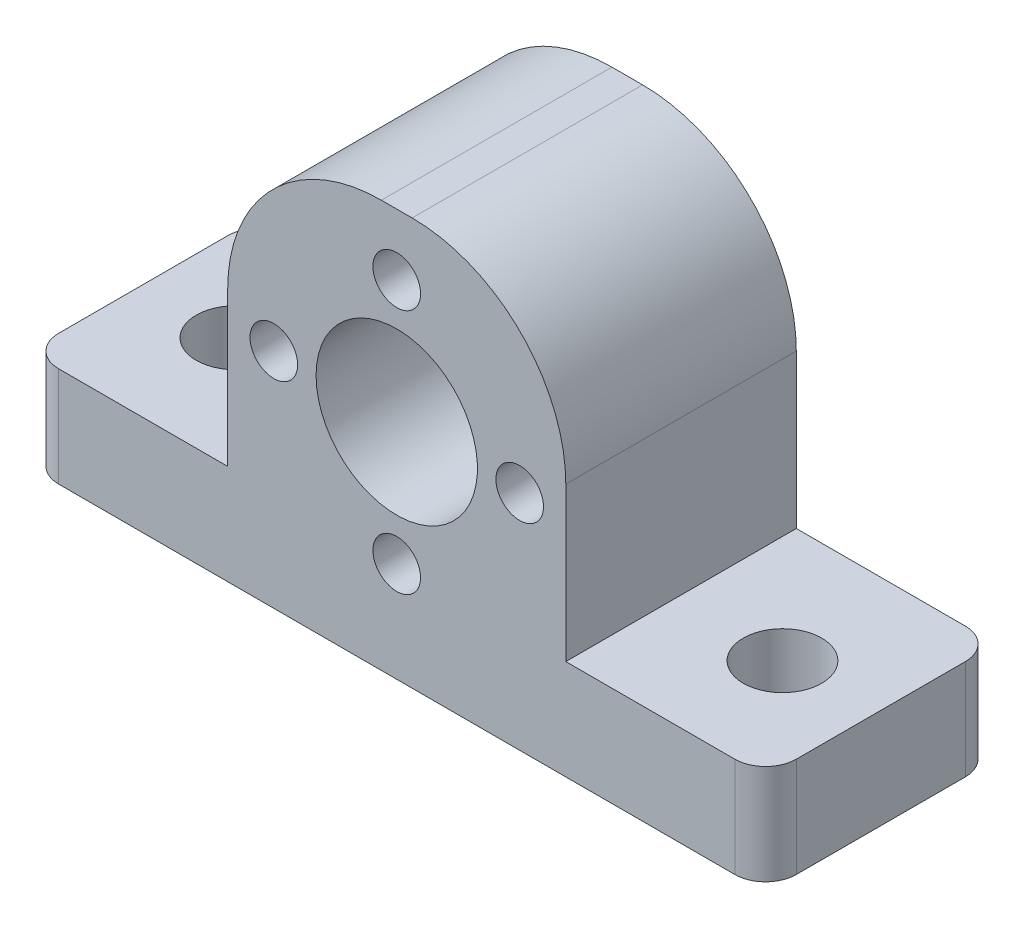
ISO-10303-21;
HEADER;
FILE_DESCRIPTION(('STEP AP214'),'2;1');
FILE_NAME('part.step','',(''),(''),'','','');
FILE_SCHEMA(('AUTOMOTIVE_DESIGN { 1 0 10303 214 1 1 1 1 }'));
ENDSEC;
DATA;
#1=APPLICATION_CONTEXT('core data for automotive mechanical design processes');
#2=APPLICATION_PROTOCOL_DEFINITION('international standard','automotive_design',2000,#1);
#3=PRODUCT_CONTEXT('',#1,'mechanical');
#4=PRODUCT('Part','Part','',(#3));
#5=PRODUCT_RELATED_PRODUCT_CATEGORY('part','',(#4));
#6=PRODUCT_DEFINITION_FORMATION('','',#4);
#7=PRODUCT_DEFINITION_CONTEXT('part definition',#1,'design');
#8=PRODUCT_DEFINITION('design','',#6,#7);
#9=PRODUCT_DEFINITION_SHAPE('','',#8);
#10=(LENGTH_UNIT() NAMED_UNIT(*) SI_UNIT(.MILLI.,.METRE.));
#11=(NAMED_UNIT(*) PLANE_ANGLE_UNIT() SI_UNIT($,.RADIAN.));
#12=(NAMED_UNIT(*) SI_UNIT($,.STERADIAN.) SOLID_ANGLE_UNIT());
#13=UNCERTAINTY_MEASURE_WITH_UNIT(LENGTH_MEASURE(1.E-05),#10,'distance_accuracy_value','');
#14=(GEOMETRIC_REPRESENTATION_CONTEXT(3) GLOBAL_UNCERTAINTY_ASSIGNED_CONTEXT((#13)) GLOBAL_UNIT_ASSIGNED_CONTEXT((#10,
#11,#12)) REPRESENTATION_CONTEXT('',''));
#15=CARTESIAN_POINT('',(0.,0.,0.));
#16=DIRECTION('',(0.,0.,1.));
#17=DIRECTION('',(1.,0.,0.));
#18=AXIS2_PLACEMENT_3D('',#15,#16,#17);
#19=CARTESIAN_POINT('',(0.,6.5,0.));
#20=DIRECTION('',(0.,1.,0.));
#21=DIRECTION('',(0.,0.,1.));
#22=AXIS2_PLACEMENT_3D('',#19,#20,#21);
#23=PLANE('',#22);
#24=CARTESIAN_POINT('',(-19.9485049833887,6.5,-0.398671096345487));
#25=DIRECTION('',(0.,1.,0.));
#26=DIRECTION('',(0.,0.,1.));
#27=AXIS2_PLACEMENT_3D('',#24,#25,#26);
#28=CIRCLE('',#27,2.55);
#29=CARTESIAN_POINT('',(-19.9485049833887,6.5,2.15132890365451));
#30=VERTEX_POINT('',#29);
#31=EDGE_CURVE('E331',#30,#30,#28,.T.);
#32=ORIENTED_EDGE('',*,*,#31,.F.);
#33=EDGE_LOOP('',(#32));
#34=FACE_BOUND('',#33,.T.);
#35=DIRECTION('',(-1.,0.,0.));
#36=VECTOR('',#35,1.);
#37=CARTESIAN_POINT('',(-25.9485049833887,6.5,-7.89867109634549));
#38=LINE('',#37,#36);
#39=CARTESIAN_POINT('',(-12.9485049833887,6.5,-7.89867109634549));
#40=VERTEX_POINT('',#39);
#41=CARTESIAN_POINT('',(-23.9485049833887,6.5,-7.89867109634549));
#42=VERTEX_POINT('',#41);
#43=EDGE_CURVE('E156',#40,#42,#38,.T.);
#44=ORIENTED_EDGE('',*,*,#43,.T.);
#45=CARTESIAN_POINT('',(-23.9485049833887,6.5,-5.89867109634549));
#46=DIRECTION('',(0.,1.,0.));
#47=DIRECTION('',(0.,0.,1.));
#48=AXIS2_PLACEMENT_3D('',#45,#46,#47);
#49=CIRCLE('',#48,2.);
#50=CARTESIAN_POINT('',(-25.9485049833887,6.5,-5.89867109634549));
#51=VERTEX_POINT('',#50);
#52=EDGE_CURVE('E11',#42,#51,#49,.T.);
#53=ORIENTED_EDGE('',*,*,#52,.T.);
#54=DIRECTION('',(0.,0.,1.));
#55=VECTOR('',#54,1.);
#56=CARTESIAN_POINT('',(-25.9485049833887,6.5,-7.89867109634549));
#57=LINE('',#56,#55);
#58=CARTESIAN_POINT('',(-25.9485049833887,6.5,5.10132890365451));
#59=VERTEX_POINT('',#58);
#60=EDGE_CURVE('E194',#51,#59,#57,.T.);
#61=ORIENTED_EDGE('',*,*,#60,.T.);
#62=CARTESIAN_POINT('',(-23.9485049833887,6.5,5.10132890365451));
#63=DIRECTION('',(0.,1.,0.));
#64=DIRECTION('',(0.,0.,1.));
#65=AXIS2_PLACEMENT_3D('',#62,#63,#64);
#66=CIRCLE('',#65,2.);
#67=CARTESIAN_POINT('',(-23.9485049833887,6.5,7.10132890365451));
#68=VERTEX_POINT('',#67);
#69=EDGE_CURVE('E48',#59,#68,#66,.T.);
#70=ORIENTED_EDGE('',*,*,#69,.T.);
#71=DIRECTION('',(1.,0.,0.));
#72=VECTOR('',#71,1.);
#73=CARTESIAN_POINT('',(-25.9485049833887,6.5,7.10132890365451));
#74=LINE('',#73,#72);
#75=CARTESIAN_POINT('',(-12.9485049833887,6.5,7.10132890365451));
#76=VERTEX_POINT('',#75);
#77=EDGE_CURVE('E199',#68,#76,#74,.T.);
#78=ORIENTED_EDGE('',*,*,#77,.T.);
#79=DIRECTION('',(0.,0.,1.));
#80=VECTOR('',#79,1.);
#81=CARTESIAN_POINT('',(-12.9485049833887,6.5,-7.89867109634549));
#82=LINE('',#81,#80);
#83=EDGE_CURVE('E173',#40,#76,#82,.T.);
#84=ORIENTED_EDGE('',*,*,#83,.F.);
#85=EDGE_LOOP('',(#44,#53,#61,#70,#78,#84));
#86=FACE_BOUND('',#85,.T.);
#87=ADVANCED_FACE('F39',(#34,#86),#23,.T.);
#88=CARTESIAN_POINT('',(-25.9485049833887,6.5,-7.89867109634549));
#89=DIRECTION('',(1.,0.,0.));
#90=DIRECTION('',(0.,0.,-1.));
#91=AXIS2_PLACEMENT_3D('',#88,#89,#90);
#92=PLANE('',#91);
#93=ORIENTED_EDGE('',*,*,#60,.F.);
#94=DIRECTION('',(0.,-1.,0.));
#95=VECTOR('',#94,1.);
#96=CARTESIAN_POINT('',(-25.9485049833887,6.5,-5.89867109634549));
#97=LINE('',#96,#95);
#98=CARTESIAN_POINT('',(-25.9485049833887,0.,-5.89867109634549));
#99=VERTEX_POINT('',#98);
#100=EDGE_CURVE('E281',#51,#99,#97,.T.);
#101=ORIENTED_EDGE('',*,*,#100,.T.);
#102=DIRECTION('',(0.,0.,1.));
#103=VECTOR('',#102,1.);
#104=CARTESIAN_POINT('',(-25.9485049833887,0.,-7.89867109634549));
#105=LINE('',#104,#103);
#106=CARTESIAN_POINT('',(-25.9485049833887,0.,5.10132890365451));
#107=VERTEX_POINT('',#106);
#108=EDGE_CURVE('E193',#99,#107,#105,.T.);
#109=ORIENTED_EDGE('',*,*,#108,.T.);
#110=DIRECTION('',(0.,-1.,0.));
#111=VECTOR('',#110,1.);
#112=CARTESIAN_POINT('',(-25.9485049833887,6.5,5.10132890365451));
#113=LINE('',#112,#111);
#114=EDGE_CURVE('E55',#107,#59,#113,.F.);
#115=ORIENTED_EDGE('',*,*,#114,.T.);
#116=EDGE_LOOP('',(#93,#101,#109,#115));
#117=FACE_BOUND('',#116,.T.);
#118=ADVANCED_FACE('F298',(#117),#92,.F.);
#119=CARTESIAN_POINT('',(-25.9485049833887,6.5,7.10132890365451));
#120=DIRECTION('',(0.,0.,-1.));
#121=DIRECTION('',(-1.,0.,0.));
#122=AXIS2_PLACEMENT_3D('',#119,#120,#121);
#123=PLANE('',#122);
#124=CARTESIAN_POINT('',(-1.94850498338871,22.5,7.10132890365451));
#125=DIRECTION('',(0.,0.,-1.));
#126=DIRECTION('',(-1.,0.,0.));
#127=AXIS2_PLACEMENT_3D('',#124,#125,#126);
#128=CIRCLE('',#127,1.55);
#129=CARTESIAN_POINT('',(-3.49850498338871,22.5,7.10132890365451));
#130=VERTEX_POINT('',#129);
#131=EDGE_CURVE('E327',#130,#130,#128,.T.);
#132=ORIENTED_EDGE('',*,*,#131,.T.);
#133=EDGE_LOOP('',(#132));
#134=FACE_BOUND('',#133,.T.);
#135=CARTESIAN_POINT('',(-9.94850498338871,14.5,7.10132890365451));
#136=DIRECTION('',(0.,0.,-1.));
#137=DIRECTION('',(-1.,0.,0.));
#138=AXIS2_PLACEMENT_3D('',#135,#136,#137);
#139=CIRCLE('',#138,1.55);
#140=CARTESIAN_POINT('',(-11.4985049833887,14.5,7.10132890365451));
#141=VERTEX_POINT('',#140);
#142=EDGE_CURVE('E341',#141,#141,#139,.T.);
#143=ORIENTED_EDGE('',*,*,#142,.T.);
#144=EDGE_LOOP('',(#143));
#145=FACE_BOUND('',#144,.T.);
#146=CARTESIAN_POINT('',(-1.94850498338871,6.5,7.10132890365451));
#147=DIRECTION('',(0.,0.,-1.));
#148=DIRECTION('',(-1.,0.,0.));
#149=AXIS2_PLACEMENT_3D('',#146,#147,#148);
#150=CIRCLE('',#149,1.55);
#151=CARTESIAN_POINT('',(-3.49850498338871,6.5,7.10132890365451));
#152=VERTEX_POINT('',#151);
#153=EDGE_CURVE('E345',#152,#152,#150,.T.);
#154=ORIENTED_EDGE('',*,*,#153,.T.);
#155=EDGE_LOOP('',(#154));
#156=FACE_BOUND('',#155,.T.);
#157=CARTESIAN_POINT('',(6.05149501661129,14.5,7.10132890365451));
#158=DIRECTION('',(0.,0.,-1.));
#159=DIRECTION('',(-1.,0.,0.));
#160=AXIS2_PLACEMENT_3D('',#157,#158,#159);
#161=CIRCLE('',#160,1.55);
#162=CARTESIAN_POINT('',(4.50149501661129,14.5,7.10132890365451));
#163=VERTEX_POINT('',#162);
#164=EDGE_CURVE('E349',#163,#163,#161,.T.);
#165=ORIENTED_EDGE('',*,*,#164,.T.);
#166=EDGE_LOOP('',(#165));
#167=FACE_BOUND('',#166,.T.);
#168=CARTESIAN_POINT('',(-1.94850498338871,14.5,7.10132890365451));
#169=DIRECTION('',(0.,0.,-1.));
#170=DIRECTION('',(-1.,0.,0.));
#171=AXIS2_PLACEMENT_3D('',#168,#169,#170);
#172=CIRCLE('',#171,5.25);
#173=CARTESIAN_POINT('',(-7.19850498338871,14.5,7.10132890365451));
#174=VERTEX_POINT('',#173);
#175=EDGE_CURVE('E353',#174,#174,#172,.T.);
#176=ORIENTED_EDGE('',*,*,#175,.T.);
#177=EDGE_LOOP('',(#176));
#178=FACE_BOUND('',#177,.T.);
#179=DIRECTION('',(1.,0.,0.));
#180=VECTOR('',#179,1.);
#181=CARTESIAN_POINT('',(-25.9485049833887,0.,7.10132890365451));
#182=LINE('',#181,#180);
#183=CARTESIAN_POINT('',(-23.9485049833887,0.,7.10132890365451));
#184=VERTEX_POINT('',#183);
#185=CARTESIAN_POINT('',(20.0514950166113,0.,7.10132890365451));
#186=VERTEX_POINT('',#185);
#187=EDGE_CURVE('E207',#184,#186,#182,.T.);
#188=ORIENTED_EDGE('',*,*,#187,.T.);
#189=DIRECTION('',(0.,-1.,0.));
#190=VECTOR('',#189,1.);
#191=CARTESIAN_POINT('',(20.0514950166113,6.5,7.10132890365451));
#192=LINE('',#191,#190);
#193=CARTESIAN_POINT('',(20.0514950166113,6.5,7.10132890365451));
#194=VERTEX_POINT('',#193);
#195=EDGE_CURVE('E276',#186,#194,#192,.F.);
#196=ORIENTED_EDGE('',*,*,#195,.T.);
#197=CARTESIAN_POINT('',(9.05149501661129,6.5,7.10132890365451));
#198=VERTEX_POINT('',#197);
#199=EDGE_CURVE('E197',#198,#194,#74,.T.);
#200=ORIENTED_EDGE('',*,*,#199,.F.);
#201=DIRECTION('',(0.,-1.,0.));
#202=VECTOR('',#201,1.);
#203=CARTESIAN_POINT('',(9.05149501661129,26.5,7.10132890365451));
#204=LINE('',#203,#202);
#205=CARTESIAN_POINT('',(9.05149501661129,16.5,7.10132890365451));
#206=VERTEX_POINT('',#205);
#207=EDGE_CURVE('E166',#206,#198,#204,.T.);
#208=ORIENTED_EDGE('',*,*,#207,.F.);
#209=CARTESIAN_POINT('',(-0.948504983388705,16.5,7.10132890365451));
#210=DIRECTION('',(0.,0.,-1.));
#211=DIRECTION('',(-1.,0.,0.));
#212=AXIS2_PLACEMENT_3D('',#209,#210,#211);
#213=CIRCLE('',#212,10.);
#214=CARTESIAN_POINT('',(-0.948504983388705,26.5,7.10132890365451));
#215=VERTEX_POINT('',#214);
#216=EDGE_CURVE('E236',#206,#215,#213,.F.);
#217=ORIENTED_EDGE('',*,*,#216,.T.);
#218=DIRECTION('',(1.,0.,0.));
#219=VECTOR('',#218,1.);
#220=CARTESIAN_POINT('',(-12.9485049833887,26.5,7.10132890365451));
#221=LINE('',#220,#219);
#222=CARTESIAN_POINT('',(-2.9485049833887,26.5,7.10132890365451));
#223=VERTEX_POINT('',#222);
#224=EDGE_CURVE('E172',#223,#215,#221,.T.);
#225=ORIENTED_EDGE('',*,*,#224,.F.);
#226=CARTESIAN_POINT('',(-2.9485049833887,16.5,7.10132890365451));
#227=DIRECTION('',(0.,0.,-1.));
#228=DIRECTION('',(-1.,0.,0.));
#229=AXIS2_PLACEMENT_3D('',#226,#227,#228);
#230=CIRCLE('',#229,10.);
#231=CARTESIAN_POINT('',(-12.9485049833887,16.5,7.10132890365451));
#232=VERTEX_POINT('',#231);
#233=EDGE_CURVE('E233',#223,#232,#230,.F.);
#234=ORIENTED_EDGE('',*,*,#233,.T.);
#235=DIRECTION('',(0.,-1.,0.));
#236=VECTOR('',#235,1.);
#237=CARTESIAN_POINT('',(-12.9485049833887,26.5,7.10132890365451));
#238=LINE('',#237,#236);
#239=EDGE_CURVE('E189',#232,#76,#238,.T.);
#240=ORIENTED_EDGE('',*,*,#239,.T.);
#241=ORIENTED_EDGE('',*,*,#77,.F.);
#242=DIRECTION('',(0.,-1.,0.));
#243=VECTOR('',#242,1.);
#244=CARTESIAN_POINT('',(-23.9485049833887,6.5,7.10132890365451));
#245=LINE('',#244,#243);
#246=EDGE_CURVE('E272',#68,#184,#245,.T.);
#247=ORIENTED_EDGE('',*,*,#246,.T.);
#248=EDGE_LOOP('',(#188,#196,#200,#208,#217,#225,#234,#240,#241,#247));
#249=FACE_BOUND('',#248,.T.);
#250=ADVANCED_FACE('F291',(#134,#145,#156,#167,#178,#249),#123,.F.);
#251=CARTESIAN_POINT('',(22.0514950166113,6.5,-7.89867109634549));
#252=DIRECTION('',(-1.,0.,0.));
#253=DIRECTION('',(0.,0.,1.));
#254=AXIS2_PLACEMENT_3D('',#251,#252,#253);
#255=PLANE('',#254);
#256=DIRECTION('',(0.,0.,-1.));
#257=VECTOR('',#256,1.);
#258=CARTESIAN_POINT('',(22.0514950166113,0.,-7.89867109634549));
#259=LINE('',#258,#257);
#260=CARTESIAN_POINT('',(22.0514950166113,0.,5.10132890365451));
#261=VERTEX_POINT('',#260);
#262=CARTESIAN_POINT('',(22.0514950166113,0.,-5.89867109634549));
#263=VERTEX_POINT('',#262);
#264=EDGE_CURVE('E211',#261,#263,#259,.T.);
#265=ORIENTED_EDGE('',*,*,#264,.T.);
#266=DIRECTION('',(0.,-1.,0.));
#267=VECTOR('',#266,1.);
#268=CARTESIAN_POINT('',(22.0514950166113,6.5,-5.89867109634549));
#269=LINE('',#268,#267);
#270=CARTESIAN_POINT('',(22.0514950166113,6.5,-5.89867109634549));
#271=VERTEX_POINT('',#270);
#272=EDGE_CURVE('E264',#263,#271,#269,.F.);
#273=ORIENTED_EDGE('',*,*,#272,.T.);
#274=DIRECTION('',(0.,0.,-1.));
#275=VECTOR('',#274,1.);
#276=CARTESIAN_POINT('',(22.0514950166113,6.5,-7.89867109634549));
#277=LINE('',#276,#275);
#278=CARTESIAN_POINT('',(22.0514950166113,6.5,5.10132890365451));
#279=VERTEX_POINT('',#278);
#280=EDGE_CURVE('E202',#279,#271,#277,.T.);
#281=ORIENTED_EDGE('',*,*,#280,.F.);
#282=DIRECTION('',(0.,-1.,0.));
#283=VECTOR('',#282,1.);
#284=CARTESIAN_POINT('',(22.0514950166113,6.5,5.10132890365451));
#285=LINE('',#284,#283);
#286=EDGE_CURVE('E260',#279,#261,#285,.T.);
#287=ORIENTED_EDGE('',*,*,#286,.T.);
#288=EDGE_LOOP('',(#265,#273,#281,#287));
#289=FACE_BOUND('',#288,.T.);
#290=ADVANCED_FACE('F309',(#289),#255,.F.);
#291=CARTESIAN_POINT('',(-25.9485049833887,6.5,-7.89867109634549));
#292=DIRECTION('',(0.,0.,1.));
#293=DIRECTION('',(1.,0.,0.));
#294=AXIS2_PLACEMENT_3D('',#291,#292,#293);
#295=PLANE('',#294);
#296=CARTESIAN_POINT('',(-1.94850498338871,22.5,-7.89867109634549));
#297=DIRECTION('',(0.,0.,-1.));
#298=DIRECTION('',(-1.,0.,0.));
#299=AXIS2_PLACEMENT_3D('',#296,#297,#298);
#300=CIRCLE('',#299,1.55);
#301=CARTESIAN_POINT('',(-3.49850498338871,22.5,-7.89867109634549));
#302=VERTEX_POINT('',#301);
#303=EDGE_CURVE('E361',#302,#302,#300,.T.);
#304=ORIENTED_EDGE('',*,*,#303,.F.);
#305=EDGE_LOOP('',(#304));
#306=FACE_BOUND('',#305,.T.);
#307=CARTESIAN_POINT('',(-9.94850498338871,14.5,-7.89867109634549));
#308=DIRECTION('',(0.,0.,-1.));
#309=DIRECTION('',(-1.,0.,0.));
#310=AXIS2_PLACEMENT_3D('',#307,#308,#309);
#311=CIRCLE('',#310,1.55);
#312=CARTESIAN_POINT('',(-11.4985049833887,14.5,-7.89867109634549));
#313=VERTEX_POINT('',#312);
#314=EDGE_CURVE('E362',#313,#313,#311,.T.);
#315=ORIENTED_EDGE('',*,*,#314,.F.);
#316=EDGE_LOOP('',(#315));
#317=FACE_BOUND('',#316,.T.);
#318=CARTESIAN_POINT('',(-1.94850498338871,6.5,-7.89867109634549));
#319=DIRECTION('',(0.,0.,-1.));
#320=DIRECTION('',(-1.,0.,0.));
#321=AXIS2_PLACEMENT_3D('',#318,#319,#320);
#322=CIRCLE('',#321,1.55);
#323=CARTESIAN_POINT('',(-3.49850498338871,6.5,-7.89867109634549));
#324=VERTEX_POINT('',#323);
#325=EDGE_CURVE('E366',#324,#324,#322,.T.);
#326=ORIENTED_EDGE('',*,*,#325,.F.);
#327=EDGE_LOOP('',(#326));
#328=FACE_BOUND('',#327,.T.);
#329=CARTESIAN_POINT('',(6.05149501661129,14.5,-7.89867109634549));
#330=DIRECTION('',(0.,0.,-1.));
#331=DIRECTION('',(-1.,0.,0.));
#332=AXIS2_PLACEMENT_3D('',#329,#330,#331);
#333=CIRCLE('',#332,1.55);
#334=CARTESIAN_POINT('',(4.50149501661129,14.5,-7.89867109634549));
#335=VERTEX_POINT('',#334);
#336=EDGE_CURVE('E370',#335,#335,#333,.T.);
#337=ORIENTED_EDGE('',*,*,#336,.F.);
#338=EDGE_LOOP('',(#337));
#339=FACE_BOUND('',#338,.T.);
#340=CARTESIAN_POINT('',(-1.94850498338871,14.5,-7.89867109634549));
#341=DIRECTION('',(0.,0.,-1.));
#342=DIRECTION('',(-1.,0.,0.));
#343=AXIS2_PLACEMENT_3D('',#340,#341,#342);
#344=CIRCLE('',#343,5.25);
#345=CARTESIAN_POINT('',(-7.19850498338871,14.5,-7.89867109634549));
#346=VERTEX_POINT('',#345);
#347=EDGE_CURVE('E357',#346,#346,#344,.T.);
#348=ORIENTED_EDGE('',*,*,#347,.F.);
#349=EDGE_LOOP('',(#348));
#350=FACE_BOUND('',#349,.T.);
#351=CARTESIAN_POINT('',(20.0514950166113,6.5,-7.89867109634549));
#352=VERTEX_POINT('',#351);
#353=CARTESIAN_POINT('',(9.05149501661129,6.5,-7.89867109634549));
#354=VERTEX_POINT('',#353);
#355=EDGE_CURVE('E141',#352,#354,#38,.T.);
#356=ORIENTED_EDGE('',*,*,#355,.F.);
#357=DIRECTION('',(0.,-1.,0.));
#358=VECTOR('',#357,1.);
#359=CARTESIAN_POINT('',(20.0514950166113,6.5,-7.89867109634549));
#360=LINE('',#359,#358);
#361=CARTESIAN_POINT('',(20.0514950166113,0.,-7.89867109634549));
#362=VERTEX_POINT('',#361);
#363=EDGE_CURVE('E245',#352,#362,#360,.T.);
#364=ORIENTED_EDGE('',*,*,#363,.T.);
#365=DIRECTION('',(-1.,0.,0.));
#366=VECTOR('',#365,1.);
#367=CARTESIAN_POINT('',(-25.9485049833887,0.,-7.89867109634549));
#368=LINE('',#367,#366);
#369=CARTESIAN_POINT('',(-23.9485049833887,0.,-7.89867109634549));
#370=VERTEX_POINT('',#369);
#371=EDGE_CURVE('E198',#362,#370,#368,.T.);
#372=ORIENTED_EDGE('',*,*,#371,.T.);
#373=DIRECTION('',(0.,-1.,0.));
#374=VECTOR('',#373,1.);
#375=CARTESIAN_POINT('',(-23.9485049833887,6.5,-7.89867109634549));
#376=LINE('',#375,#374);
#377=EDGE_CURVE('E242',#370,#42,#376,.F.);
#378=ORIENTED_EDGE('',*,*,#377,.T.);
#379=ORIENTED_EDGE('',*,*,#43,.F.);
#380=DIRECTION('',(0.,-1.,0.));
#381=VECTOR('',#380,1.);
#382=CARTESIAN_POINT('',(-12.9485049833887,26.5,-7.89867109634549));
#383=LINE('',#382,#381);
#384=CARTESIAN_POINT('',(-12.9485049833887,16.5,-7.89867109634549));
#385=VERTEX_POINT('',#384);
#386=EDGE_CURVE('E167',#385,#40,#383,.T.);
#387=ORIENTED_EDGE('',*,*,#386,.F.);
#388=CARTESIAN_POINT('',(-2.94850498338871,16.5,-7.89867109634549));
#389=DIRECTION('',(0.,0.,1.));
#390=DIRECTION('',(1.,0.,0.));
#391=AXIS2_PLACEMENT_3D('',#388,#389,#390);
#392=CIRCLE('',#391,10.);
#393=CARTESIAN_POINT('',(-2.94850498338871,26.5,-7.89867109634549));
#394=VERTEX_POINT('',#393);
#395=EDGE_CURVE('E225',#385,#394,#392,.F.);
#396=ORIENTED_EDGE('',*,*,#395,.T.);
#397=DIRECTION('',(-1.,0.,0.));
#398=VECTOR('',#397,1.);
#399=CARTESIAN_POINT('',(-12.9485049833887,26.5,-7.89867109634549));
#400=LINE('',#399,#398);
#401=CARTESIAN_POINT('',(-0.948504983388705,26.5,-7.89867109634549));
#402=VERTEX_POINT('',#401);
#403=EDGE_CURVE('E178',#402,#394,#400,.T.);
#404=ORIENTED_EDGE('',*,*,#403,.F.);
#405=CARTESIAN_POINT('',(-0.948504983388705,16.5,-7.89867109634549));
#406=DIRECTION('',(0.,0.,1.));
#407=DIRECTION('',(1.,0.,0.));
#408=AXIS2_PLACEMENT_3D('',#405,#406,#407);
#409=CIRCLE('',#408,10.);
#410=CARTESIAN_POINT('',(9.05149501661129,16.5,-7.89867109634549));
#411=VERTEX_POINT('',#410);
#412=EDGE_CURVE('E162',#402,#411,#409,.F.);
#413=ORIENTED_EDGE('',*,*,#412,.T.);
#414=DIRECTION('',(0.,-1.,0.));
#415=VECTOR('',#414,1.);
#416=CARTESIAN_POINT('',(9.05149501661129,26.5,-7.89867109634549));
#417=LINE('',#416,#415);
#418=EDGE_CURVE('E159',#411,#354,#417,.T.);
#419=ORIENTED_EDGE('',*,*,#418,.T.);
#420=EDGE_LOOP('',(#356,#364,#372,#378,#379,#387,#396,#404,#413,#419));
#421=FACE_BOUND('',#420,.T.);
#422=ADVANCED_FACE('F160',(#306,#317,#328,#339,#350,#421),#295,.F.);
#423=CARTESIAN_POINT('',(16.0514950166113,6.5,0.));
#424=DIRECTION('',(0.,1.,0.));
#425=DIRECTION('',(0.,0.,1.));
#426=AXIS2_PLACEMENT_3D('',#423,#424,#425);
#427=CIRCLE('',#426,2.55);
#428=CARTESIAN_POINT('',(16.0514950166113,6.5,2.55));
#429=VERTEX_POINT('',#428);
#430=EDGE_CURVE('E322',#429,#429,#427,.T.);
#431=ORIENTED_EDGE('',*,*,#430,.F.);
#432=EDGE_LOOP('',(#431));
#433=FACE_BOUND('',#432,.T.);
#434=ORIENTED_EDGE('',*,*,#280,.T.);
#435=CARTESIAN_POINT('',(20.0514950166113,6.5,-5.89867109634549));
#436=DIRECTION('',(0.,1.,0.));
#437=DIRECTION('',(0.,0.,1.));
#438=AXIS2_PLACEMENT_3D('',#435,#436,#437);
#439=CIRCLE('',#438,2.);
#440=EDGE_CURVE('E150',#271,#352,#439,.T.);
#441=ORIENTED_EDGE('',*,*,#440,.T.);
#442=ORIENTED_EDGE('',*,*,#355,.T.);
#443=DIRECTION('',(0.,0.,-1.));
#444=VECTOR('',#443,1.);
#445=CARTESIAN_POINT('',(9.05149501661129,6.5,-7.89867109634549));
#446=LINE('',#445,#444);
#447=EDGE_CURVE('E147',#198,#354,#446,.T.);
#448=ORIENTED_EDGE('',*,*,#447,.F.);
#449=ORIENTED_EDGE('',*,*,#199,.T.);
#450=CARTESIAN_POINT('',(20.0514950166113,6.5,5.10132890365451));
#451=DIRECTION('',(0.,1.,0.));
#452=DIRECTION('',(0.,0.,1.));
#453=AXIS2_PLACEMENT_3D('',#450,#451,#452);
#454=CIRCLE('',#453,2.);
#455=EDGE_CURVE('E267',#194,#279,#454,.T.);
#456=ORIENTED_EDGE('',*,*,#455,.T.);
#457=EDGE_LOOP('',(#434,#441,#442,#448,#449,#456));
#458=FACE_BOUND('',#457,.T.);
#459=ADVANCED_FACE('F144',(#433,#458),#23,.T.);
#460=CARTESIAN_POINT('',(0.,0.,0.));
#461=DIRECTION('',(0.,1.,0.));
#462=DIRECTION('',(0.,0.,1.));
#463=AXIS2_PLACEMENT_3D('',#460,#461,#462);
#464=PLANE('',#463);
#465=CARTESIAN_POINT('',(-19.9485049833887,0.,-0.398671096345487));
#466=DIRECTION('',(0.,1.,0.));
#467=DIRECTION('',(0.,0.,1.));
#468=AXIS2_PLACEMENT_3D('',#465,#466,#467);
#469=CIRCLE('',#468,2.55);
#470=CARTESIAN_POINT('',(-19.9485049833887,0.,2.15132890365451));
#471=VERTEX_POINT('',#470);
#472=EDGE_CURVE('E181',#471,#471,#469,.T.);
#473=ORIENTED_EDGE('',*,*,#472,.T.);
#474=EDGE_LOOP('',(#473));
#475=FACE_BOUND('',#474,.T.);
#476=CARTESIAN_POINT('',(16.0514950166113,0.,0.));
#477=DIRECTION('',(0.,1.,0.));
#478=DIRECTION('',(0.,0.,1.));
#479=AXIS2_PLACEMENT_3D('',#476,#477,#478);
#480=CIRCLE('',#479,2.55);
#481=CARTESIAN_POINT('',(16.0514950166113,0.,2.55));
#482=VERTEX_POINT('',#481);
#483=EDGE_CURVE('E326',#482,#482,#480,.T.);
#484=ORIENTED_EDGE('',*,*,#483,.T.);
#485=EDGE_LOOP('',(#484));
#486=FACE_BOUND('',#485,.T.);
#487=ORIENTED_EDGE('',*,*,#371,.F.);
#488=CARTESIAN_POINT('',(20.0514950166113,0.,-5.89867109634549));
#489=DIRECTION('',(0.,1.,0.));
#490=DIRECTION('',(0.,0.,1.));
#491=AXIS2_PLACEMENT_3D('',#488,#489,#490);
#492=CIRCLE('',#491,2.);
#493=EDGE_CURVE('E257',#362,#263,#492,.F.);
#494=ORIENTED_EDGE('',*,*,#493,.T.);
#495=ORIENTED_EDGE('',*,*,#264,.F.);
#496=CARTESIAN_POINT('',(20.0514950166113,0.,5.10132890365451));
#497=DIRECTION('',(0.,1.,0.));
#498=DIRECTION('',(0.,0.,1.));
#499=AXIS2_PLACEMENT_3D('',#496,#497,#498);
#500=CIRCLE('',#499,2.);
#501=EDGE_CURVE('E254',#261,#186,#500,.F.);
#502=ORIENTED_EDGE('',*,*,#501,.T.);
#503=ORIENTED_EDGE('',*,*,#187,.F.);
#504=CARTESIAN_POINT('',(-23.9485049833887,0.,5.10132890365451));
#505=DIRECTION('',(0.,1.,0.));
#506=DIRECTION('',(0.,0.,1.));
#507=AXIS2_PLACEMENT_3D('',#504,#505,#506);
#508=CIRCLE('',#507,2.);
#509=EDGE_CURVE('E248',#184,#107,#508,.F.);
#510=ORIENTED_EDGE('',*,*,#509,.T.);
#511=ORIENTED_EDGE('',*,*,#108,.F.);
#512=CARTESIAN_POINT('',(-23.9485049833887,0.,-5.89867109634549));
#513=DIRECTION('',(0.,1.,0.));
#514=DIRECTION('',(0.,0.,1.));
#515=AXIS2_PLACEMENT_3D('',#512,#513,#514);
#516=CIRCLE('',#515,2.);
#517=EDGE_CURVE('E251',#99,#370,#516,.F.);
#518=ORIENTED_EDGE('',*,*,#517,.T.);
#519=EDGE_LOOP('',(#487,#494,#495,#502,#503,#510,#511,#518));
#520=FACE_BOUND('',#519,.T.);
#521=ADVANCED_FACE('F297',(#475,#486,#520),#464,.F.);
#522=CARTESIAN_POINT('',(-12.9485049833887,26.5,-7.89867109634549));
#523=DIRECTION('',(1.,0.,0.));
#524=DIRECTION('',(0.,0.,-1.));
#525=AXIS2_PLACEMENT_3D('',#522,#523,#524);
#526=PLANE('',#525);
#527=ORIENTED_EDGE('',*,*,#239,.F.);
#528=DIRECTION('',(0.,0.,1.));
#529=VECTOR('',#528,1.);
#530=CARTESIAN_POINT('',(-12.9485049833887,16.5,-7.89867109634549));
#531=LINE('',#530,#529);
#532=EDGE_CURVE('E239',#232,#385,#531,.F.);
#533=ORIENTED_EDGE('',*,*,#532,.T.);
#534=ORIENTED_EDGE('',*,*,#386,.T.);
#535=ORIENTED_EDGE('',*,*,#83,.T.);
#536=EDGE_LOOP('',(#527,#533,#534,#535));
#537=FACE_BOUND('',#536,.T.);
#538=ADVANCED_FACE('F420',(#537),#526,.F.);
#539=CARTESIAN_POINT('',(9.05149501661129,26.5,-7.89867109634549));
#540=DIRECTION('',(-1.,0.,0.));
#541=DIRECTION('',(0.,0.,1.));
#542=AXIS2_PLACEMENT_3D('',#539,#540,#541);
#543=PLANE('',#542);
#544=ORIENTED_EDGE('',*,*,#418,.F.);
#545=DIRECTION('',(0.,0.,-1.));
#546=VECTOR('',#545,1.);
#547=CARTESIAN_POINT('',(9.05149501661129,16.5,7.10132890365451));
#548=LINE('',#547,#546);
#549=EDGE_CURVE('E230',#411,#206,#548,.F.);
#550=ORIENTED_EDGE('',*,*,#549,.T.);
#551=ORIENTED_EDGE('',*,*,#207,.T.);
#552=ORIENTED_EDGE('',*,*,#447,.T.);
#553=EDGE_LOOP('',(#544,#550,#551,#552));
#554=FACE_BOUND('',#553,.T.);
#555=ADVANCED_FACE('F169',(#554),#543,.F.);
#556=CARTESIAN_POINT('',(0.,26.5,0.));
#557=DIRECTION('',(0.,1.,0.));
#558=DIRECTION('',(0.,0.,1.));
#559=AXIS2_PLACEMENT_3D('',#556,#557,#558);
#560=PLANE('',#559);
#561=ORIENTED_EDGE('',*,*,#224,.T.);
#562=DIRECTION('',(0.,0.,-1.));
#563=VECTOR('',#562,1.);
#564=CARTESIAN_POINT('',(-0.948504983388705,26.5,-7.89867109634549));
#565=LINE('',#564,#563);
#566=EDGE_CURVE('E221',#215,#402,#565,.T.);
#567=ORIENTED_EDGE('',*,*,#566,.T.);
#568=ORIENTED_EDGE('',*,*,#403,.T.);
#569=DIRECTION('',(0.,0.,1.));
#570=VECTOR('',#569,1.);
#571=CARTESIAN_POINT('',(-2.9485049833887,26.5,7.10132890365451));
#572=LINE('',#571,#570);
#573=EDGE_CURVE('E155',#394,#223,#572,.T.);
#574=ORIENTED_EDGE('',*,*,#573,.T.);
#575=EDGE_LOOP('',(#561,#567,#568,#574));
#576=FACE_BOUND('',#575,.T.);
#577=ADVANCED_FACE('F440',(#576),#560,.T.);
#578=CARTESIAN_POINT('',(-0.948504983388705,16.5,0.));
#579=DIRECTION('',(0.,0.,1.));
#580=DIRECTION('',(1.,0.,0.));
#581=AXIS2_PLACEMENT_3D('',#578,#579,#580);
#582=CYLINDRICAL_SURFACE('',#581,10.);
#583=ORIENTED_EDGE('',*,*,#216,.F.);
#584=ORIENTED_EDGE('',*,*,#549,.F.);
#585=ORIENTED_EDGE('',*,*,#412,.F.);
#586=ORIENTED_EDGE('',*,*,#566,.F.);
#587=EDGE_LOOP('',(#583,#584,#585,#586));
#588=FACE_BOUND('',#587,.T.);
#589=ADVANCED_FACE('F435',(#588),#582,.T.);
#590=CARTESIAN_POINT('',(-2.94850498338871,16.5,0.));
#591=DIRECTION('',(0.,0.,-1.));
#592=DIRECTION('',(-1.,0.,0.));
#593=AXIS2_PLACEMENT_3D('',#590,#591,#592);
#594=CYLINDRICAL_SURFACE('',#593,10.);
#595=ORIENTED_EDGE('',*,*,#395,.F.);
#596=ORIENTED_EDGE('',*,*,#532,.F.);
#597=ORIENTED_EDGE('',*,*,#233,.F.);
#598=ORIENTED_EDGE('',*,*,#573,.F.);
#599=EDGE_LOOP('',(#595,#596,#597,#598));
#600=FACE_BOUND('',#599,.T.);
#601=ADVANCED_FACE('F426',(#600),#594,.T.);
#602=CARTESIAN_POINT('',(16.0514950166113,0.,0.));
#603=DIRECTION('',(0.,1.,0.));
#604=DIRECTION('',(0.,0.,1.));
#605=AXIS2_PLACEMENT_3D('',#602,#603,#604);
#606=CYLINDRICAL_SURFACE('',#605,2.55);
#607=CARTESIAN_POINT('',(16.0514950166113,0.,2.55));
#608=CARTESIAN_POINT('',(16.0514950166113,0.0677083333333332,2.55));
#609=CARTESIAN_POINT('',(16.0514950166113,0.135416666666667,2.55));
#610=CARTESIAN_POINT('',(16.0514950166113,0.270833333333333,2.55));
#611=CARTESIAN_POINT('',(16.0514950166113,0.338541666666667,2.55));
#612=CARTESIAN_POINT('',(16.0514950166113,0.473958333333333,2.55));
#613=CARTESIAN_POINT('',(16.0514950166113,0.541666666666667,2.55));
#614=CARTESIAN_POINT('',(16.0514950166113,0.677083333333333,2.55));
#615=CARTESIAN_POINT('',(16.0514950166113,0.744791666666667,2.55));
#616=CARTESIAN_POINT('',(16.0514950166113,0.880208333333333,2.55));
#617=CARTESIAN_POINT('',(16.0514950166113,0.947916666666667,2.55));
#618=CARTESIAN_POINT('',(16.0514950166113,1.08333333333333,2.55));
#619=CARTESIAN_POINT('',(16.0514950166113,1.15104166666667,2.55));
#620=CARTESIAN_POINT('',(16.0514950166113,1.28645833333333,2.55));
#621=CARTESIAN_POINT('',(16.0514950166113,1.35416666666667,2.55));
#622=CARTESIAN_POINT('',(16.0514950166113,1.48958333333333,2.55));
#623=CARTESIAN_POINT('',(16.0514950166113,1.55729166666667,2.55));
#624=CARTESIAN_POINT('',(16.0514950166113,1.69270833333333,2.55));
#625=CARTESIAN_POINT('',(16.0514950166113,1.76041666666667,2.55));
#626=CARTESIAN_POINT('',(16.0514950166113,1.89583333333333,2.55));
#627=CARTESIAN_POINT('',(16.0514950166113,1.96354166666667,2.55));
#628=CARTESIAN_POINT('',(16.0514950166113,2.09895833333333,2.55));
#629=CARTESIAN_POINT('',(16.0514950166113,2.16666666666667,2.55));
#630=CARTESIAN_POINT('',(16.0514950166113,2.30208333333333,2.55));
#631=CARTESIAN_POINT('',(16.0514950166113,2.36979166666667,2.55));
#632=CARTESIAN_POINT('',(16.0514950166113,2.50520833333333,2.55));
#633=CARTESIAN_POINT('',(16.0514950166113,2.57291666666667,2.55));
#634=CARTESIAN_POINT('',(16.0514950166113,2.70833333333333,2.55));
#635=CARTESIAN_POINT('',(16.0514950166113,2.77604166666667,2.55));
#636=CARTESIAN_POINT('',(16.0514950166113,2.91145833333333,2.55));
#637=CARTESIAN_POINT('',(16.0514950166113,2.97916666666667,2.55));
#638=CARTESIAN_POINT('',(16.0514950166113,3.11458333333333,2.55));
#639=CARTESIAN_POINT('',(16.0514950166113,3.18229166666667,2.55));
#640=CARTESIAN_POINT('',(16.0514950166113,3.31770833333333,2.55));
#641=CARTESIAN_POINT('',(16.0514950166113,3.38541666666667,2.55));
#642=CARTESIAN_POINT('',(16.0514950166113,3.52083333333333,2.55));
#643=CARTESIAN_POINT('',(16.0514950166113,3.58854166666667,2.55));
#644=CARTESIAN_POINT('',(16.0514950166113,3.72395833333333,2.55));
#645=CARTESIAN_POINT('',(16.0514950166113,3.79166666666667,2.55));
#646=CARTESIAN_POINT('',(16.0514950166113,3.92708333333333,2.55));
#647=CARTESIAN_POINT('',(16.0514950166113,3.99479166666667,2.55));
#648=CARTESIAN_POINT('',(16.0514950166113,4.13020833333333,2.55));
#649=CARTESIAN_POINT('',(16.0514950166113,4.19791666666667,2.55));
#650=CARTESIAN_POINT('',(16.0514950166113,4.33333333333333,2.55));
#651=CARTESIAN_POINT('',(16.0514950166113,4.40104166666667,2.55));
#652=CARTESIAN_POINT('',(16.0514950166113,4.53645833333333,2.55));
#653=CARTESIAN_POINT('',(16.0514950166113,4.60416666666667,2.55));
#654=CARTESIAN_POINT('',(16.0514950166113,4.73958333333333,2.55));
#655=CARTESIAN_POINT('',(16.0514950166113,4.80729166666667,2.55));
#656=CARTESIAN_POINT('',(16.0514950166113,4.94270833333333,2.55));
#657=CARTESIAN_POINT('',(16.0514950166113,5.01041666666667,2.55));
#658=CARTESIAN_POINT('',(16.0514950166113,5.14583333333333,2.55));
#659=CARTESIAN_POINT('',(16.0514950166113,5.21354166666667,2.55));
#660=CARTESIAN_POINT('',(16.0514950166113,5.34895833333333,2.55));
#661=CARTESIAN_POINT('',(16.0514950166113,5.41666666666667,2.55));
#662=CARTESIAN_POINT('',(16.0514950166113,5.55208333333333,2.55));
#663=CARTESIAN_POINT('',(16.0514950166113,5.61979166666667,2.55));
#664=CARTESIAN_POINT('',(16.0514950166113,5.75520833333333,2.55));
#665=CARTESIAN_POINT('',(16.0514950166113,5.82291666666667,2.55));
#666=CARTESIAN_POINT('',(16.0514950166113,5.95833333333333,2.55));
#667=CARTESIAN_POINT('',(16.0514950166113,6.02604166666667,2.55));
#668=CARTESIAN_POINT('',(16.0514950166113,6.16145833333333,2.55));
#669=CARTESIAN_POINT('',(16.0514950166113,6.22916666666667,2.55));
#670=CARTESIAN_POINT('',(16.0514950166113,6.36458333333333,2.55));
#671=CARTESIAN_POINT('',(16.0514950166113,6.43229166666667,2.55));
#672=CARTESIAN_POINT('',(16.0514950166113,6.5,2.55));
#673=B_SPLINE_CURVE_WITH_KNOTS('',3,(#607,#608,#609,#610,#611,#612,#613,#614,#615,#616,#617,
#618,#619,#620,#621,#622,#623,#624,#625,#626,#627,#628,#629,#630,#631,#632,#633,#634,#635,#636,
#637,#638,#639,#640,#641,#642,#643,#644,#645,#646,#647,#648,#649,#650,#651,#652,#653,#654,#655,
#656,#657,#658,#659,#660,#661,#662,#663,#664,#665,#666,#667,#668,#669,#670,#671,#672),
.UNSPECIFIED.,.F.,.F.,(4,2,2,2,2,2,2,2,2,2,2,2,2,2,2,2,2,2,2,2,2,2,2,2,2,2,2,2,2,2,2,2,4),(0.,
0.203125,0.40625,0.609375,0.8125,1.015625,1.21875,1.421875,1.625,1.828125,2.03125,2.234375,
2.4375,2.640625,2.84375,3.046875,3.25,3.453125,3.65625,3.859375,4.0625,4.265625,4.46875,
4.671875,4.875,5.078125,5.28125,5.484375,5.6875,5.890625,6.09375,6.296875,6.5),.UNSPECIFIED.);
#674=EDGE_CURVE('BSEAM424',#482,#429,#673,.T.);
#675=ORIENTED_EDGE('',*,*,#483,.F.);
#676=ORIENTED_EDGE('',*,*,#430,.T.);
#677=ORIENTED_EDGE('',*,*,#674,.T.);
#678=ORIENTED_EDGE('',*,*,#674,.F.);
#679=EDGE_LOOP('',(#675,#677,#676,#678));
#680=FACE_BOUND('',#679,.T.);
#681=ADVANCED_FACE('F424',(#680),#606,.F.);
#682=CARTESIAN_POINT('',(-19.9485049833887,0.,-0.398671096345487));
#683=DIRECTION('',(0.,1.,0.));
#684=DIRECTION('',(0.,0.,1.));
#685=AXIS2_PLACEMENT_3D('',#682,#683,#684);
#686=CYLINDRICAL_SURFACE('',#685,2.55);
#687=CARTESIAN_POINT('',(-19.9485049833887,0.,2.15132890365451));
#688=CARTESIAN_POINT('',(-19.9485049833887,0.0677083333333332,2.15132890365451));
#689=CARTESIAN_POINT('',(-19.9485049833887,0.135416666666667,2.15132890365451));
#690=CARTESIAN_POINT('',(-19.9485049833887,0.270833333333333,2.15132890365451));
#691=CARTESIAN_POINT('',(-19.9485049833887,0.338541666666667,2.15132890365451));
#692=CARTESIAN_POINT('',(-19.9485049833887,0.473958333333333,2.15132890365451));
#693=CARTESIAN_POINT('',(-19.9485049833887,0.541666666666667,2.15132890365451));
#694=CARTESIAN_POINT('',(-19.9485049833887,0.677083333333333,2.15132890365451));
#695=CARTESIAN_POINT('',(-19.9485049833887,0.744791666666667,2.15132890365451));
#696=CARTESIAN_POINT('',(-19.9485049833887,0.880208333333333,2.15132890365451));
#697=CARTESIAN_POINT('',(-19.9485049833887,0.947916666666667,2.15132890365451));
#698=CARTESIAN_POINT('',(-19.9485049833887,1.08333333333333,2.15132890365451));
#699=CARTESIAN_POINT('',(-19.9485049833887,1.15104166666667,2.15132890365451));
#700=CARTESIAN_POINT('',(-19.9485049833887,1.28645833333333,2.15132890365451));
#701=CARTESIAN_POINT('',(-19.9485049833887,1.35416666666667,2.15132890365451));
#702=CARTESIAN_POINT('',(-19.9485049833887,1.48958333333333,2.15132890365451));
#703=CARTESIAN_POINT('',(-19.9485049833887,1.55729166666667,2.15132890365451));
#704=CARTESIAN_POINT('',(-19.9485049833887,1.69270833333333,2.15132890365451));
#705=CARTESIAN_POINT('',(-19.9485049833887,1.76041666666667,2.15132890365451));
#706=CARTESIAN_POINT('',(-19.9485049833887,1.89583333333333,2.15132890365451));
#707=CARTESIAN_POINT('',(-19.9485049833887,1.96354166666667,2.15132890365451));
#708=CARTESIAN_POINT('',(-19.9485049833887,2.09895833333333,2.15132890365451));
#709=CARTESIAN_POINT('',(-19.9485049833887,2.16666666666667,2.15132890365451));
#710=CARTESIAN_POINT('',(-19.9485049833887,2.30208333333333,2.15132890365451));
#711=CARTESIAN_POINT('',(-19.9485049833887,2.36979166666667,2.15132890365451));
#712=CARTESIAN_POINT('',(-19.9485049833887,2.50520833333333,2.15132890365451));
#713=CARTESIAN_POINT('',(-19.9485049833887,2.57291666666667,2.15132890365451));
#714=CARTESIAN_POINT('',(-19.9485049833887,2.70833333333333,2.15132890365451));
#715=CARTESIAN_POINT('',(-19.9485049833887,2.77604166666667,2.15132890365451));
#716=CARTESIAN_POINT('',(-19.9485049833887,2.91145833333333,2.15132890365451));
#717=CARTESIAN_POINT('',(-19.9485049833887,2.97916666666667,2.15132890365451));
#718=CARTESIAN_POINT('',(-19.9485049833887,3.11458333333333,2.15132890365451));
#719=CARTESIAN_POINT('',(-19.9485049833887,3.18229166666667,2.15132890365451));
#720=CARTESIAN_POINT('',(-19.9485049833887,3.31770833333333,2.15132890365451));
#721=CARTESIAN_POINT('',(-19.9485049833887,3.38541666666667,2.15132890365451));
#722=CARTESIAN_POINT('',(-19.9485049833887,3.52083333333333,2.15132890365451));
#723=CARTESIAN_POINT('',(-19.9485049833887,3.58854166666667,2.15132890365451));
#724=CARTESIAN_POINT('',(-19.9485049833887,3.72395833333333,2.15132890365451));
#725=CARTESIAN_POINT('',(-19.9485049833887,3.79166666666667,2.15132890365451));
#726=CARTESIAN_POINT('',(-19.9485049833887,3.92708333333333,2.15132890365451));
#727=CARTESIAN_POINT('',(-19.9485049833887,3.99479166666667,2.15132890365451));
#728=CARTESIAN_POINT('',(-19.9485049833887,4.13020833333333,2.15132890365451));
#729=CARTESIAN_POINT('',(-19.9485049833887,4.19791666666667,2.15132890365451));
#730=CARTESIAN_POINT('',(-19.9485049833887,4.33333333333333,2.15132890365451));
#731=CARTESIAN_POINT('',(-19.9485049833887,4.40104166666667,2.15132890365451));
#732=CARTESIAN_POINT('',(-19.9485049833887,4.53645833333333,2.15132890365451));
#733=CARTESIAN_POINT('',(-19.9485049833887,4.60416666666667,2.15132890365451));
#734=CARTESIAN_POINT('',(-19.9485049833887,4.73958333333333,2.15132890365451));
#735=CARTESIAN_POINT('',(-19.9485049833887,4.80729166666667,2.15132890365451));
#736=CARTESIAN_POINT('',(-19.9485049833887,4.94270833333333,2.15132890365451));
#737=CARTESIAN_POINT('',(-19.9485049833887,5.01041666666667,2.15132890365451));
#738=CARTESIAN_POINT('',(-19.9485049833887,5.14583333333333,2.15132890365451));
#739=CARTESIAN_POINT('',(-19.9485049833887,5.21354166666667,2.15132890365451));
#740=CARTESIAN_POINT('',(-19.9485049833887,5.34895833333333,2.15132890365451));
#741=CARTESIAN_POINT('',(-19.9485049833887,5.41666666666667,2.15132890365451));
#742=CARTESIAN_POINT('',(-19.9485049833887,5.55208333333333,2.15132890365451));
#743=CARTESIAN_POINT('',(-19.9485049833887,5.61979166666667,2.15132890365451));
#744=CARTESIAN_POINT('',(-19.9485049833887,5.75520833333333,2.15132890365451));
#745=CARTESIAN_POINT('',(-19.9485049833887,5.82291666666667,2.15132890365451));
#746=CARTESIAN_POINT('',(-19.9485049833887,5.95833333333333,2.15132890365451));
#747=CARTESIAN_POINT('',(-19.9485049833887,6.02604166666667,2.15132890365451));
#748=CARTESIAN_POINT('',(-19.9485049833887,6.16145833333333,2.15132890365451));
#749=CARTESIAN_POINT('',(-19.9485049833887,6.22916666666667,2.15132890365451));
#750=CARTESIAN_POINT('',(-19.9485049833887,6.36458333333333,2.15132890365451));
#751=CARTESIAN_POINT('',(-19.9485049833887,6.43229166666667,2.15132890365451));
#752=CARTESIAN_POINT('',(-19.9485049833887,6.5,2.15132890365451));
#753=B_SPLINE_CURVE_WITH_KNOTS('',3,(#687,#688,#689,#690,#691,#692,#693,#694,#695,#696,#697,
#698,#699,#700,#701,#702,#703,#704,#705,#706,#707,#708,#709,#710,#711,#712,#713,#714,#715,#716,
#717,#718,#719,#720,#721,#722,#723,#724,#725,#726,#727,#728,#729,#730,#731,#732,#733,#734,#735,
#736,#737,#738,#739,#740,#741,#742,#743,#744,#745,#746,#747,#748,#749,#750,#751,#752),
.UNSPECIFIED.,.F.,.F.,(4,2,2,2,2,2,2,2,2,2,2,2,2,2,2,2,2,2,2,2,2,2,2,2,2,2,2,2,2,2,2,2,4),(0.,
0.203125,0.40625,0.609375,0.8125,1.015625,1.21875,1.421875,1.625,1.828125,2.03125,2.234375,
2.4375,2.640625,2.84375,3.046875,3.25,3.453125,3.65625,3.859375,4.0625,4.265625,4.46875,
4.671875,4.875,5.078125,5.28125,5.484375,5.6875,5.890625,6.09375,6.296875,6.5),.UNSPECIFIED.);
#754=EDGE_CURVE('BSEAM393',#471,#30,#753,.T.);
#755=ORIENTED_EDGE('',*,*,#472,.F.);
#756=ORIENTED_EDGE('',*,*,#31,.T.);
#757=ORIENTED_EDGE('',*,*,#754,.T.);
#758=ORIENTED_EDGE('',*,*,#754,.F.);
#759=EDGE_LOOP('',(#755,#757,#756,#758));
#760=FACE_BOUND('',#759,.T.);
#761=ADVANCED_FACE('F393',(#760),#686,.F.);
#762=CARTESIAN_POINT('',(-1.94850498338871,14.5,12.1013289036545));
#763=DIRECTION('',(0.,0.,-1.));
#764=DIRECTION('',(-1.,0.,0.));
#765=AXIS2_PLACEMENT_3D('',#762,#763,#764);
#766=CYLINDRICAL_SURFACE('',#765,5.25);
#767=ORIENTED_EDGE('',*,*,#347,.T.);
#768=EDGE_LOOP('',(#767));
#769=FACE_BOUND('',#768,.T.);
#770=ORIENTED_EDGE('',*,*,#175,.F.);
#771=EDGE_LOOP('',(#770));
#772=FACE_BOUND('',#771,.T.);
#773=ADVANCED_FACE('F389',(#769,#772),#766,.F.);
#774=CARTESIAN_POINT('',(6.05149501661129,14.5,12.1013289036545));
#775=DIRECTION('',(0.,0.,-1.));
#776=DIRECTION('',(-1.,0.,0.));
#777=AXIS2_PLACEMENT_3D('',#774,#775,#776);
#778=CYLINDRICAL_SURFACE('',#777,1.55);
#779=ORIENTED_EDGE('',*,*,#336,.T.);
#780=EDGE_LOOP('',(#779));
#781=FACE_BOUND('',#780,.T.);
#782=ORIENTED_EDGE('',*,*,#164,.F.);
#783=EDGE_LOOP('',(#782));
#784=FACE_BOUND('',#783,.T.);
#785=ADVANCED_FACE('F392',(#781,#784),#778,.F.);
#786=CARTESIAN_POINT('',(-1.94850498338871,6.5,12.1013289036545));
#787=DIRECTION('',(0.,0.,-1.));
#788=DIRECTION('',(-1.,0.,0.));
#789=AXIS2_PLACEMENT_3D('',#786,#787,#788);
#790=CYLINDRICAL_SURFACE('',#789,1.55);
#791=ORIENTED_EDGE('',*,*,#325,.T.);
#792=EDGE_LOOP('',(#791));
#793=FACE_BOUND('',#792,.T.);
#794=ORIENTED_EDGE('',*,*,#153,.F.);
#795=EDGE_LOOP('',(#794));
#796=FACE_BOUND('',#795,.T.);
#797=ADVANCED_FACE('F378',(#793,#796),#790,.F.);
#798=CARTESIAN_POINT('',(-9.94850498338871,14.5,12.1013289036545));
#799=DIRECTION('',(0.,0.,-1.));
#800=DIRECTION('',(-1.,0.,0.));
#801=AXIS2_PLACEMENT_3D('',#798,#799,#800);
#802=CYLINDRICAL_SURFACE('',#801,1.55);
#803=ORIENTED_EDGE('',*,*,#314,.T.);
#804=EDGE_LOOP('',(#803));
#805=FACE_BOUND('',#804,.T.);
#806=ORIENTED_EDGE('',*,*,#142,.F.);
#807=EDGE_LOOP('',(#806));
#808=FACE_BOUND('',#807,.T.);
#809=ADVANCED_FACE('F535',(#805,#808),#802,.F.);
#810=CARTESIAN_POINT('',(-1.94850498338871,22.5,12.1013289036545));
#811=DIRECTION('',(0.,0.,-1.));
#812=DIRECTION('',(-1.,0.,0.));
#813=AXIS2_PLACEMENT_3D('',#810,#811,#812);
#814=CYLINDRICAL_SURFACE('',#813,1.55);
#815=ORIENTED_EDGE('',*,*,#303,.T.);
#816=EDGE_LOOP('',(#815));
#817=FACE_BOUND('',#816,.T.);
#818=ORIENTED_EDGE('',*,*,#131,.F.);
#819=EDGE_LOOP('',(#818));
#820=FACE_BOUND('',#819,.T.);
#821=ADVANCED_FACE('F463',(#817,#820),#814,.F.);
#822=CARTESIAN_POINT('',(20.0514950166113,6.5,-5.89867109634549));
#823=DIRECTION('',(0.,-1.,0.));
#824=DIRECTION('',(0.,0.,-1.));
#825=AXIS2_PLACEMENT_3D('',#822,#823,#824);
#826=CYLINDRICAL_SURFACE('',#825,2.);
#827=ORIENTED_EDGE('',*,*,#440,.F.);
#828=ORIENTED_EDGE('',*,*,#272,.F.);
#829=ORIENTED_EDGE('',*,*,#493,.F.);
#830=ORIENTED_EDGE('',*,*,#363,.F.);
#831=EDGE_LOOP('',(#827,#828,#829,#830));
#832=FACE_BOUND('',#831,.T.);
#833=ADVANCED_FACE('F305',(#832),#826,.T.);
#834=CARTESIAN_POINT('',(20.0514950166113,6.5,5.10132890365451));
#835=DIRECTION('',(0.,-1.,0.));
#836=DIRECTION('',(0.,0.,-1.));
#837=AXIS2_PLACEMENT_3D('',#834,#835,#836);
#838=CYLINDRICAL_SURFACE('',#837,2.);
#839=ORIENTED_EDGE('',*,*,#455,.F.);
#840=ORIENTED_EDGE('',*,*,#195,.F.);
#841=ORIENTED_EDGE('',*,*,#501,.F.);
#842=ORIENTED_EDGE('',*,*,#286,.F.);
#843=EDGE_LOOP('',(#839,#840,#841,#842));
#844=FACE_BOUND('',#843,.T.);
#845=ADVANCED_FACE('F314',(#844),#838,.T.);
#846=CARTESIAN_POINT('',(-23.9485049833887,6.5,-5.89867109634549));
#847=DIRECTION('',(0.,-1.,0.));
#848=DIRECTION('',(0.,0.,-1.));
#849=AXIS2_PLACEMENT_3D('',#846,#847,#848);
#850=CYLINDRICAL_SURFACE('',#849,2.);
#851=ORIENTED_EDGE('',*,*,#52,.F.);
#852=ORIENTED_EDGE('',*,*,#377,.F.);
#853=ORIENTED_EDGE('',*,*,#517,.F.);
#854=ORIENTED_EDGE('',*,*,#100,.F.);
#855=EDGE_LOOP('',(#851,#852,#853,#854));
#856=FACE_BOUND('',#855,.T.);
#857=ADVANCED_FACE('F301',(#856),#850,.T.);
#858=CARTESIAN_POINT('',(-23.9485049833887,6.5,5.10132890365451));
#859=DIRECTION('',(0.,-1.,0.));
#860=DIRECTION('',(0.,0.,-1.));
#861=AXIS2_PLACEMENT_3D('',#858,#859,#860);
#862=CYLINDRICAL_SURFACE('',#861,2.);
#863=ORIENTED_EDGE('',*,*,#69,.F.);
#864=ORIENTED_EDGE('',*,*,#114,.F.);
#865=ORIENTED_EDGE('',*,*,#509,.F.);
#866=ORIENTED_EDGE('',*,*,#246,.F.);
#867=EDGE_LOOP('',(#863,#864,#865,#866));
#868=FACE_BOUND('',#867,.T.);
#869=ADVANCED_FACE('F41',(#868),#862,.T.);
#870=CLOSED_SHELL('',(#87,#118,#250,#290,#422,#459,#521,#538,#555,#577,#589,#601,#681,#761,#773,
#785,#797,#809,#821,#833,#845,#857,#869));
#871=MANIFOLD_SOLID_BREP('B2',#870);
#872=ADVANCED_BREP_SHAPE_REPRESENTATION('',(#18,#871),#14);
#873=SHAPE_DEFINITION_REPRESENTATION(#9,#872);
ENDSEC;
END-ISO-10303-21;
